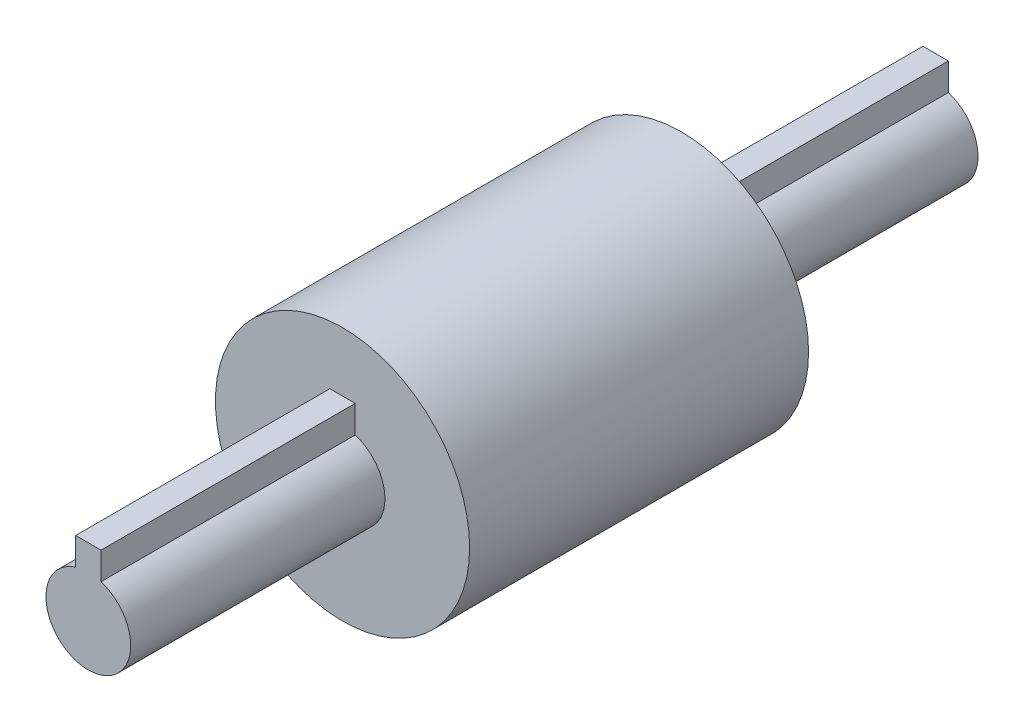
ISO-10303-21;
HEADER;
FILE_DESCRIPTION(('STEP AP214'),'2;1');
FILE_NAME('part.step','',(''),(''),'','','');
FILE_SCHEMA(('AUTOMOTIVE_DESIGN { 1 0 10303 214 1 1 1 1 }'));
ENDSEC;
DATA;
#1=APPLICATION_CONTEXT('core data for automotive mechanical design processes');
#2=APPLICATION_PROTOCOL_DEFINITION('international standard','automotive_design',2000,#1);
#3=PRODUCT_CONTEXT('',#1,'mechanical');
#4=PRODUCT('Part','Part','',(#3));
#5=PRODUCT_RELATED_PRODUCT_CATEGORY('part','',(#4));
#6=PRODUCT_DEFINITION_FORMATION('','',#4);
#7=PRODUCT_DEFINITION_CONTEXT('part definition',#1,'design');
#8=PRODUCT_DEFINITION('design','',#6,#7);
#9=PRODUCT_DEFINITION_SHAPE('','',#8);
#10=(LENGTH_UNIT() NAMED_UNIT(*) SI_UNIT(.MILLI.,.METRE.));
#11=(NAMED_UNIT(*) PLANE_ANGLE_UNIT() SI_UNIT($,.RADIAN.));
#12=(NAMED_UNIT(*) SI_UNIT($,.STERADIAN.) SOLID_ANGLE_UNIT());
#13=UNCERTAINTY_MEASURE_WITH_UNIT(LENGTH_MEASURE(1.E-05),#10,'distance_accuracy_value','');
#14=(GEOMETRIC_REPRESENTATION_CONTEXT(3) GLOBAL_UNCERTAINTY_ASSIGNED_CONTEXT((#13)) GLOBAL_UNIT_ASSIGNED_CONTEXT((#10,
#11,#12)) REPRESENTATION_CONTEXT('',''));
#15=CARTESIAN_POINT('',(0.,0.,0.));
#16=DIRECTION('',(0.,0.,1.));
#17=DIRECTION('',(1.,0.,0.));
#18=AXIS2_PLACEMENT_3D('',#15,#16,#17);
#19=CARTESIAN_POINT('',(-1.5,0.,30.));
#20=DIRECTION('',(-1.,0.,0.));
#21=DIRECTION('',(0.,0.,1.));
#22=AXIS2_PLACEMENT_3D('',#19,#20,#21);
#23=PLANE('',#22);
#24=DIRECTION('',(0.,1.,0.));
#25=VECTOR('',#24,1.);
#26=CARTESIAN_POINT('',(-1.5,0.,0.));
#27=LINE('',#26,#25);
#28=CARTESIAN_POINT('',(-1.5,4.76969600708473,0.));
#29=VERTEX_POINT('',#28);
#30=CARTESIAN_POINT('',(-1.5,8.,0.));
#31=VERTEX_POINT('',#30);
#32=EDGE_CURVE('E143',#29,#31,#27,.T.);
#33=ORIENTED_EDGE('',*,*,#32,.F.);
#34=DIRECTION('',(0.,0.,-1.));
#35=VECTOR('',#34,1.);
#36=CARTESIAN_POINT('',(-1.5,4.76969600708473,30.));
#37=LINE('',#36,#35);
#38=CARTESIAN_POINT('',(-1.5,4.76969600708473,30.));
#39=VERTEX_POINT('',#38);
#40=EDGE_CURVE('E48',#39,#29,#37,.T.);
#41=ORIENTED_EDGE('',*,*,#40,.F.);
#42=DIRECTION('',(0.,1.,0.));
#43=VECTOR('',#42,1.);
#44=CARTESIAN_POINT('',(-1.5,0.,30.));
#45=LINE('',#44,#43);
#46=CARTESIAN_POINT('',(-1.5,8.,30.));
#47=VERTEX_POINT('',#46);
#48=EDGE_CURVE('E144',#39,#47,#45,.T.);
#49=ORIENTED_EDGE('',*,*,#48,.T.);
#50=DIRECTION('',(0.,0.,-1.));
#51=VECTOR('',#50,1.);
#52=CARTESIAN_POINT('',(-1.5,8.,30.));
#53=LINE('',#52,#51);
#54=EDGE_CURVE('E156',#47,#31,#53,.T.);
#55=ORIENTED_EDGE('',*,*,#54,.T.);
#56=EDGE_LOOP('',(#33,#41,#49,#55));
#57=FACE_BOUND('',#56,.T.);
#58=ADVANCED_FACE('F41',(#57),#23,.T.);
#59=CARTESIAN_POINT('',(0.,0.,30.));
#60=DIRECTION('',(0.,0.,-1.));
#61=DIRECTION('',(-1.,0.,0.));
#62=AXIS2_PLACEMENT_3D('',#59,#60,#61);
#63=CYLINDRICAL_SURFACE('',#62,5.);
#64=CARTESIAN_POINT('',(0.,0.,0.));
#65=DIRECTION('',(0.,0.,1.));
#66=DIRECTION('',(1.,0.,0.));
#67=AXIS2_PLACEMENT_3D('',#64,#65,#66);
#68=CIRCLE('',#67,5.);
#69=CARTESIAN_POINT('',(1.5,4.76969600708473,0.));
#70=VERTEX_POINT('',#69);
#71=EDGE_CURVE('E159',#29,#70,#68,.T.);
#72=ORIENTED_EDGE('',*,*,#71,.T.);
#73=DIRECTION('',(0.,0.,-1.));
#74=VECTOR('',#73,1.);
#75=CARTESIAN_POINT('',(1.5,4.76969600708473,30.));
#76=LINE('',#75,#74);
#77=CARTESIAN_POINT('',(1.5,4.76969600708473,30.));
#78=VERTEX_POINT('',#77);
#79=EDGE_CURVE('E170',#78,#70,#76,.T.);
#80=ORIENTED_EDGE('',*,*,#79,.F.);
#81=CARTESIAN_POINT('',(0.,0.,30.));
#82=DIRECTION('',(0.,0.,1.));
#83=DIRECTION('',(1.,0.,0.));
#84=AXIS2_PLACEMENT_3D('',#81,#82,#83);
#85=CIRCLE('',#84,5.);
#86=EDGE_CURVE('E147',#39,#78,#85,.T.);
#87=ORIENTED_EDGE('',*,*,#86,.F.);
#88=ORIENTED_EDGE('',*,*,#40,.T.);
#89=EDGE_LOOP('',(#72,#80,#87,#88));
#90=FACE_BOUND('',#89,.T.);
#91=ADVANCED_FACE('F175',(#90),#63,.T.);
#92=CARTESIAN_POINT('',(1.5,0.,30.));
#93=DIRECTION('',(1.,0.,0.));
#94=DIRECTION('',(0.,0.,-1.));
#95=AXIS2_PLACEMENT_3D('',#92,#93,#94);
#96=PLANE('',#95);
#97=DIRECTION('',(0.,-1.,0.));
#98=VECTOR('',#97,1.);
#99=CARTESIAN_POINT('',(1.5,0.,0.));
#100=LINE('',#99,#98);
#101=CARTESIAN_POINT('',(1.5,8.,0.));
#102=VERTEX_POINT('',#101);
#103=EDGE_CURVE('E162',#102,#70,#100,.T.);
#104=ORIENTED_EDGE('',*,*,#103,.F.);
#105=DIRECTION('',(0.,0.,-1.));
#106=VECTOR('',#105,1.);
#107=CARTESIAN_POINT('',(1.5,8.,30.));
#108=LINE('',#107,#106);
#109=CARTESIAN_POINT('',(1.5,8.,30.));
#110=VERTEX_POINT('',#109);
#111=EDGE_CURVE('E168',#110,#102,#108,.T.);
#112=ORIENTED_EDGE('',*,*,#111,.F.);
#113=DIRECTION('',(0.,-1.,0.));
#114=VECTOR('',#113,1.);
#115=CARTESIAN_POINT('',(1.5,0.,30.));
#116=LINE('',#115,#114);
#117=EDGE_CURVE('E150',#110,#78,#116,.T.);
#118=ORIENTED_EDGE('',*,*,#117,.T.);
#119=ORIENTED_EDGE('',*,*,#79,.T.);
#120=EDGE_LOOP('',(#104,#112,#118,#119));
#121=FACE_BOUND('',#120,.T.);
#122=ADVANCED_FACE('F188',(#121),#96,.T.);
#123=CARTESIAN_POINT('',(0.,8.,30.));
#124=DIRECTION('',(0.,1.,0.));
#125=DIRECTION('',(0.,0.,1.));
#126=AXIS2_PLACEMENT_3D('',#123,#124,#125);
#127=PLANE('',#126);
#128=DIRECTION('',(1.,0.,0.));
#129=VECTOR('',#128,1.);
#130=CARTESIAN_POINT('',(0.,8.,0.));
#131=LINE('',#130,#129);
#132=EDGE_CURVE('E148',#31,#102,#131,.T.);
#133=ORIENTED_EDGE('',*,*,#132,.F.);
#134=ORIENTED_EDGE('',*,*,#54,.F.);
#135=DIRECTION('',(1.,0.,0.));
#136=VECTOR('',#135,1.);
#137=CARTESIAN_POINT('',(0.,8.,30.));
#138=LINE('',#137,#136);
#139=EDGE_CURVE('E153',#47,#110,#138,.T.);
#140=ORIENTED_EDGE('',*,*,#139,.T.);
#141=ORIENTED_EDGE('',*,*,#111,.T.);
#142=EDGE_LOOP('',(#133,#134,#140,#141));
#143=FACE_BOUND('',#142,.T.);
#144=ADVANCED_FACE('F185',(#143),#127,.T.);
#145=CARTESIAN_POINT('',(0.,0.,0.));
#146=DIRECTION('',(0.,0.,1.));
#147=DIRECTION('',(1.,0.,0.));
#148=AXIS2_PLACEMENT_3D('',#145,#146,#147);
#149=PLANE('',#148);
#150=ORIENTED_EDGE('',*,*,#32,.T.);
#151=ORIENTED_EDGE('',*,*,#132,.T.);
#152=ORIENTED_EDGE('',*,*,#103,.T.);
#153=ORIENTED_EDGE('',*,*,#71,.F.);
#154=EDGE_LOOP('',(#150,#151,#152,#153));
#155=FACE_BOUND('',#154,.T.);
#156=ADVANCED_FACE('F180',(#155),#149,.F.);
#157=CARTESIAN_POINT('',(0.,0.,55.));
#158=DIRECTION('',(0.,0.,-1.));
#159=DIRECTION('',(-1.,0.,0.));
#160=AXIS2_PLACEMENT_3D('',#157,#158,#159);
#161=CYLINDRICAL_SURFACE('',#160,15.);
#162=CARTESIAN_POINT('',(0.,0.,30.));
#163=DIRECTION('',(0.,0.,1.));
#164=DIRECTION('',(1.,0.,0.));
#165=AXIS2_PLACEMENT_3D('',#162,#163,#164);
#166=CIRCLE('',#165,15.);
#167=CARTESIAN_POINT('',(15.,0.,30.));
#168=VERTEX_POINT('',#167);
#169=EDGE_CURVE('E109',#168,#168,#166,.T.);
#170=ORIENTED_EDGE('',*,*,#169,.T.);
#171=EDGE_LOOP('',(#170));
#172=FACE_BOUND('',#171,.T.);
#173=CARTESIAN_POINT('',(0.,0.,70.));
#174=DIRECTION('',(0.,0.,1.));
#175=DIRECTION('',(1.,0.,0.));
#176=AXIS2_PLACEMENT_3D('',#173,#174,#175);
#177=CIRCLE('',#176,15.);
#178=CARTESIAN_POINT('',(15.,0.,70.));
#179=VERTEX_POINT('',#178);
#180=EDGE_CURVE('E128',#179,#179,#177,.T.);
#181=ORIENTED_EDGE('',*,*,#180,.F.);
#182=EDGE_LOOP('',(#181));
#183=FACE_BOUND('',#182,.T.);
#184=ADVANCED_FACE('F194',(#172,#183),#161,.T.);
#185=CARTESIAN_POINT('',(0.,0.,30.));
#186=DIRECTION('',(0.,0.,1.));
#187=DIRECTION('',(1.,0.,0.));
#188=AXIS2_PLACEMENT_3D('',#185,#186,#187);
#189=PLANE('',#188);
#190=ORIENTED_EDGE('',*,*,#48,.F.);
#191=ORIENTED_EDGE('',*,*,#86,.T.);
#192=ORIENTED_EDGE('',*,*,#117,.F.);
#193=ORIENTED_EDGE('',*,*,#139,.F.);
#194=EDGE_LOOP('',(#190,#191,#192,#193));
#195=FACE_BOUND('',#194,.T.);
#196=ORIENTED_EDGE('',*,*,#169,.F.);
#197=EDGE_LOOP('',(#196));
#198=FACE_BOUND('',#197,.T.);
#199=ADVANCED_FACE('F190',(#195,#198),#189,.F.);
#200=CARTESIAN_POINT('',(0.,0.,70.));
#201=DIRECTION('',(0.,0.,1.));
#202=DIRECTION('',(1.,0.,0.));
#203=AXIS2_PLACEMENT_3D('',#200,#201,#202);
#204=PLANE('',#203);
#205=ORIENTED_EDGE('',*,*,#180,.T.);
#206=EDGE_LOOP('',(#205));
#207=FACE_BOUND('',#206,.T.);
#208=CARTESIAN_POINT('',(0.,0.,70.));
#209=DIRECTION('',(0.,0.,1.));
#210=DIRECTION('',(1.,0.,0.));
#211=AXIS2_PLACEMENT_3D('',#208,#209,#210);
#212=CIRCLE('',#211,5.);
#213=CARTESIAN_POINT('',(-1.5,4.76969600708473,70.));
#214=VERTEX_POINT('',#213);
#215=CARTESIAN_POINT('',(1.5,4.76969600708473,70.));
#216=VERTEX_POINT('',#215);
#217=EDGE_CURVE('E55',#214,#216,#212,.T.);
#218=ORIENTED_EDGE('',*,*,#217,.F.);
#219=DIRECTION('',(0.,1.,0.));
#220=VECTOR('',#219,1.);
#221=CARTESIAN_POINT('',(-1.5,0.,70.));
#222=LINE('',#221,#220);
#223=CARTESIAN_POINT('',(-1.5,8.,70.));
#224=VERTEX_POINT('',#223);
#225=EDGE_CURVE('E11',#214,#224,#222,.T.);
#226=ORIENTED_EDGE('',*,*,#225,.T.);
#227=DIRECTION('',(1.,0.,0.));
#228=VECTOR('',#227,1.);
#229=CARTESIAN_POINT('',(0.,8.,70.));
#230=LINE('',#229,#228);
#231=CARTESIAN_POINT('',(1.5,8.,70.));
#232=VERTEX_POINT('',#231);
#233=EDGE_CURVE('E131',#224,#232,#230,.T.);
#234=ORIENTED_EDGE('',*,*,#233,.T.);
#235=DIRECTION('',(0.,1.,0.));
#236=VECTOR('',#235,1.);
#237=CARTESIAN_POINT('',(1.5,0.,70.));
#238=LINE('',#237,#236);
#239=EDGE_CURVE('E62',#216,#232,#238,.T.);
#240=ORIENTED_EDGE('',*,*,#239,.F.);
#241=EDGE_LOOP('',(#218,#226,#234,#240));
#242=FACE_BOUND('',#241,.T.);
#243=ADVANCED_FACE('F193',(#207,#242),#204,.T.);
#244=CARTESIAN_POINT('',(-1.5,0.,85.));
#245=DIRECTION('',(-1.,0.,0.));
#246=DIRECTION('',(0.,0.,1.));
#247=AXIS2_PLACEMENT_3D('',#244,#245,#246);
#248=PLANE('',#247);
#249=ORIENTED_EDGE('',*,*,#225,.F.);
#250=DIRECTION('',(0.,0.,-1.));
#251=VECTOR('',#250,1.);
#252=CARTESIAN_POINT('',(-1.5,4.76969600708473,85.));
#253=LINE('',#252,#251);
#254=CARTESIAN_POINT('',(-1.5,4.76969600708473,100.));
#255=VERTEX_POINT('',#254);
#256=EDGE_CURVE('E136',#255,#214,#253,.T.);
#257=ORIENTED_EDGE('',*,*,#256,.F.);
#258=DIRECTION('',(0.,-1.,0.));
#259=VECTOR('',#258,1.);
#260=CARTESIAN_POINT('',(-1.5,0.,100.));
#261=LINE('',#260,#259);
#262=CARTESIAN_POINT('',(-1.5,8.,100.));
#263=VERTEX_POINT('',#262);
#264=EDGE_CURVE('E123',#263,#255,#261,.T.);
#265=ORIENTED_EDGE('',*,*,#264,.F.);
#266=DIRECTION('',(0.,0.,-1.));
#267=VECTOR('',#266,1.);
#268=CARTESIAN_POINT('',(-1.5,8.,85.));
#269=LINE('',#268,#267);
#270=EDGE_CURVE('E138',#263,#224,#269,.T.);
#271=ORIENTED_EDGE('',*,*,#270,.T.);
#272=EDGE_LOOP('',(#249,#257,#265,#271));
#273=FACE_BOUND('',#272,.T.);
#274=ADVANCED_FACE('F205',(#273),#248,.T.);
#275=CARTESIAN_POINT('',(0.,8.,85.));
#276=DIRECTION('',(0.,1.,0.));
#277=DIRECTION('',(0.,0.,1.));
#278=AXIS2_PLACEMENT_3D('',#275,#276,#277);
#279=PLANE('',#278);
#280=ORIENTED_EDGE('',*,*,#233,.F.);
#281=ORIENTED_EDGE('',*,*,#270,.F.);
#282=DIRECTION('',(-1.,0.,0.));
#283=VECTOR('',#282,1.);
#284=CARTESIAN_POINT('',(0.,8.,100.));
#285=LINE('',#284,#283);
#286=CARTESIAN_POINT('',(1.5,8.,100.));
#287=VERTEX_POINT('',#286);
#288=EDGE_CURVE('E118',#287,#263,#285,.T.);
#289=ORIENTED_EDGE('',*,*,#288,.F.);
#290=DIRECTION('',(0.,0.,-1.));
#291=VECTOR('',#290,1.);
#292=CARTESIAN_POINT('',(1.5,8.,85.));
#293=LINE('',#292,#291);
#294=EDGE_CURVE('E110',#287,#232,#293,.T.);
#295=ORIENTED_EDGE('',*,*,#294,.T.);
#296=EDGE_LOOP('',(#280,#281,#289,#295));
#297=FACE_BOUND('',#296,.T.);
#298=ADVANCED_FACE('F209',(#297),#279,.T.);
#299=CARTESIAN_POINT('',(1.5,0.,85.));
#300=DIRECTION('',(-1.,0.,0.));
#301=DIRECTION('',(0.,0.,1.));
#302=AXIS2_PLACEMENT_3D('',#299,#300,#301);
#303=PLANE('',#302);
#304=DIRECTION('',(0.,0.,-1.));
#305=VECTOR('',#304,1.);
#306=CARTESIAN_POINT('',(1.5,4.76969600708473,85.));
#307=LINE('',#306,#305);
#308=CARTESIAN_POINT('',(1.5,4.76969600708473,100.));
#309=VERTEX_POINT('',#308);
#310=EDGE_CURVE('E104',#309,#216,#307,.T.);
#311=ORIENTED_EDGE('',*,*,#310,.T.);
#312=ORIENTED_EDGE('',*,*,#239,.T.);
#313=ORIENTED_EDGE('',*,*,#294,.F.);
#314=DIRECTION('',(0.,1.,0.));
#315=VECTOR('',#314,1.);
#316=CARTESIAN_POINT('',(1.5,0.,100.));
#317=LINE('',#316,#315);
#318=EDGE_CURVE('E113',#309,#287,#317,.T.);
#319=ORIENTED_EDGE('',*,*,#318,.F.);
#320=EDGE_LOOP('',(#311,#312,#313,#319));
#321=FACE_BOUND('',#320,.T.);
#322=ADVANCED_FACE('F114',(#321),#303,.F.);
#323=CARTESIAN_POINT('',(0.,0.,85.));
#324=DIRECTION('',(0.,0.,-1.));
#325=DIRECTION('',(-1.,0.,0.));
#326=AXIS2_PLACEMENT_3D('',#323,#324,#325);
#327=CYLINDRICAL_SURFACE('',#326,5.);
#328=ORIENTED_EDGE('',*,*,#256,.T.);
#329=ORIENTED_EDGE('',*,*,#217,.T.);
#330=ORIENTED_EDGE('',*,*,#310,.F.);
#331=CARTESIAN_POINT('',(0.,0.,100.));
#332=DIRECTION('',(0.,0.,1.));
#333=DIRECTION('',(1.,0.,0.));
#334=AXIS2_PLACEMENT_3D('',#331,#332,#333);
#335=CIRCLE('',#334,5.);
#336=EDGE_CURVE('E108',#255,#309,#335,.T.);
#337=ORIENTED_EDGE('',*,*,#336,.F.);
#338=EDGE_LOOP('',(#328,#329,#330,#337));
#339=FACE_BOUND('',#338,.T.);
#340=ADVANCED_FACE('F106',(#339),#327,.T.);
#341=CARTESIAN_POINT('',(0.,0.,100.));
#342=DIRECTION('',(0.,0.,1.));
#343=DIRECTION('',(1.,0.,0.));
#344=AXIS2_PLACEMENT_3D('',#341,#342,#343);
#345=PLANE('',#344);
#346=ORIENTED_EDGE('',*,*,#336,.T.);
#347=ORIENTED_EDGE('',*,*,#318,.T.);
#348=ORIENTED_EDGE('',*,*,#288,.T.);
#349=ORIENTED_EDGE('',*,*,#264,.T.);
#350=EDGE_LOOP('',(#346,#347,#348,#349));
#351=FACE_BOUND('',#350,.T.);
#352=ADVANCED_FACE('F121',(#351),#345,.T.);
#353=CLOSED_SHELL('',(#58,#91,#122,#144,#156,#184,#199,#243,#274,#298,#322,#340,#352));
#354=MANIFOLD_SOLID_BREP('B2',#353);
#355=ADVANCED_BREP_SHAPE_REPRESENTATION('',(#18,#354),#14);
#356=SHAPE_DEFINITION_REPRESENTATION(#9,#355);
ENDSEC;
END-ISO-10303-21;
